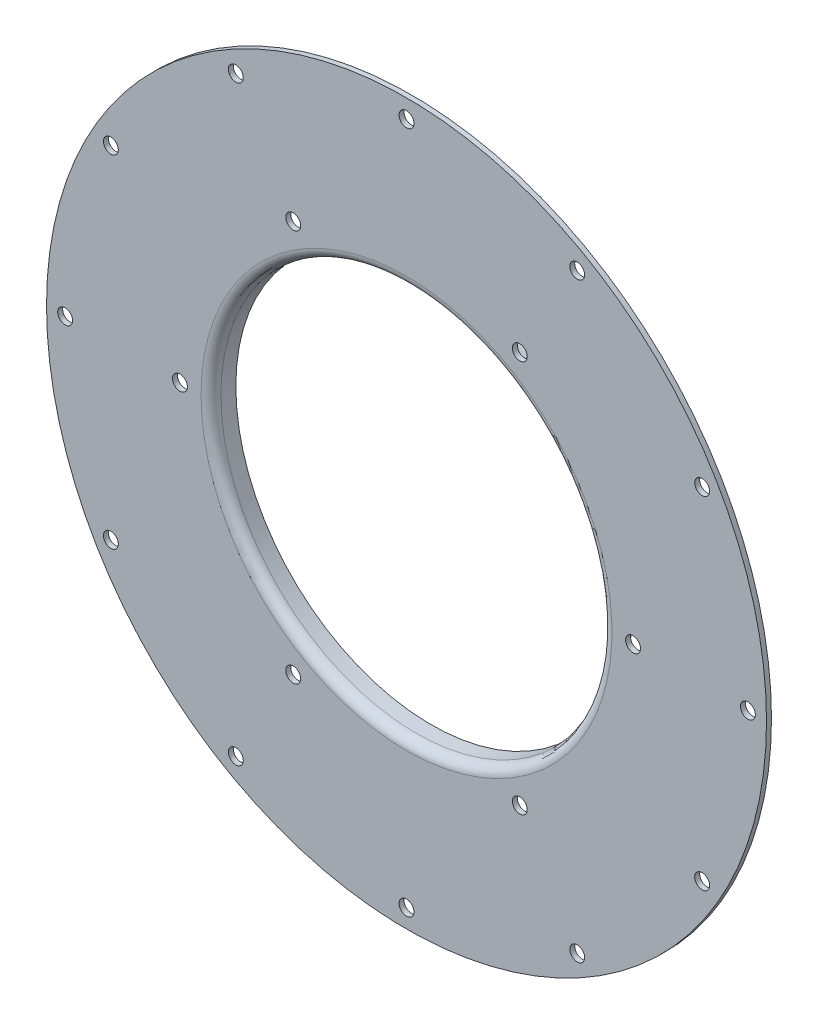
ISO-10303-21;
HEADER;
FILE_DESCRIPTION(('STEP AP214'),'2;1');
FILE_NAME('part.step','',(''),(''),'','','');
FILE_SCHEMA(('AUTOMOTIVE_DESIGN { 1 0 10303 214 1 1 1 1 }'));
ENDSEC;
DATA;
#1=APPLICATION_CONTEXT('core data for automotive mechanical design processes');
#2=APPLICATION_PROTOCOL_DEFINITION('international standard','automotive_design',2000,#1);
#3=PRODUCT_CONTEXT('',#1,'mechanical');
#4=PRODUCT('Part','Part','',(#3));
#5=PRODUCT_RELATED_PRODUCT_CATEGORY('part','',(#4));
#6=PRODUCT_DEFINITION_FORMATION('','',#4);
#7=PRODUCT_DEFINITION_CONTEXT('part definition',#1,'design');
#8=PRODUCT_DEFINITION('design','',#6,#7);
#9=PRODUCT_DEFINITION_SHAPE('','',#8);
#10=(LENGTH_UNIT() NAMED_UNIT(*) SI_UNIT(.MILLI.,.METRE.));
#11=(NAMED_UNIT(*) PLANE_ANGLE_UNIT() SI_UNIT($,.RADIAN.));
#12=(NAMED_UNIT(*) SI_UNIT($,.STERADIAN.) SOLID_ANGLE_UNIT());
#13=UNCERTAINTY_MEASURE_WITH_UNIT(LENGTH_MEASURE(1.E-05),#10,'distance_accuracy_value','');
#14=(GEOMETRIC_REPRESENTATION_CONTEXT(3) GLOBAL_UNCERTAINTY_ASSIGNED_CONTEXT((#13)) GLOBAL_UNIT_ASSIGNED_CONTEXT((#10,
#11,#12)) REPRESENTATION_CONTEXT('',''));
#15=CARTESIAN_POINT('',(0.,0.,0.));
#16=DIRECTION('',(0.,0.,1.));
#17=DIRECTION('',(1.,0.,0.));
#18=AXIS2_PLACEMENT_3D('',#15,#16,#17);
#19=CARTESIAN_POINT('',(0.,0.,0.));
#20=DIRECTION('',(0.,0.,-1.));
#21=DIRECTION('',(-1.,0.,0.));
#22=AXIS2_PLACEMENT_3D('',#19,#20,#21);
#23=CYLINDRICAL_SURFACE('',#22,161.5);
#24=CARTESIAN_POINT('',(0.,0.,-20.));
#25=DIRECTION('',(0.,0.,-1.));
#26=DIRECTION('',(-1.,0.,0.));
#27=AXIS2_PLACEMENT_3D('',#24,#25,#26);
#28=CIRCLE('',#27,161.5);
#29=CARTESIAN_POINT('',(-161.5,0.,-20.));
#30=VERTEX_POINT('',#29);
#31=EDGE_CURVE('E72',#30,#30,#28,.T.);
#32=ORIENTED_EDGE('',*,*,#31,.F.);
#33=EDGE_LOOP('',(#32));
#34=FACE_BOUND('',#33,.T.);
#35=CARTESIAN_POINT('',(0.,0.,-8.00000000000004));
#36=DIRECTION('',(0.,0.,-1.));
#37=DIRECTION('',(-1.,0.,0.));
#38=AXIS2_PLACEMENT_3D('',#35,#36,#37);
#39=CIRCLE('',#38,161.5);
#40=CARTESIAN_POINT('',(-161.5,0.,-8.00000000000004));
#41=VERTEX_POINT('',#40);
#42=EDGE_CURVE('E12',#41,#41,#39,.T.);
#43=ORIENTED_EDGE('',*,*,#42,.T.);
#44=EDGE_LOOP('',(#43));
#45=FACE_BOUND('',#44,.T.);
#46=ADVANCED_FACE('F44',(#34,#45),#23,.T.);
#47=CARTESIAN_POINT('',(0.,0.,-8.));
#48=DIRECTION('',(0.,0.,-1.));
#49=DIRECTION('',(-1.,0.,0.));
#50=AXIS2_PLACEMENT_3D('',#47,#48,#49);
#51=TOROIDAL_SURFACE('',#50,165.5,3.99999999999998);
#52=CARTESIAN_POINT('',(0.,0.,-4.00000000000001));
#53=DIRECTION('',(0.,0.,-1.));
#54=DIRECTION('',(-1.,0.,0.));
#55=AXIS2_PLACEMENT_3D('',#52,#53,#54);
#56=CIRCLE('',#55,165.5);
#57=CARTESIAN_POINT('',(-165.5,0.,-4.00000000000001));
#58=VERTEX_POINT('',#57);
#59=EDGE_CURVE('E50',#58,#58,#56,.T.);
#60=ORIENTED_EDGE('',*,*,#59,.T.);
#61=EDGE_LOOP('',(#60));
#62=FACE_BOUND('',#61,.T.);
#63=ORIENTED_EDGE('',*,*,#42,.F.);
#64=EDGE_LOOP('',(#63));
#65=FACE_BOUND('',#64,.T.);
#66=ADVANCED_FACE('F232',(#62,#65),#51,.F.);
#67=CARTESIAN_POINT('',(0.,0.,-4.00000000000001));
#68=DIRECTION('',(0.,0.,-1.));
#69=DIRECTION('',(-1.,0.,0.));
#70=AXIS2_PLACEMENT_3D('',#67,#68,#69);
#71=PLANE('',#70);
#72=CARTESIAN_POINT('',(137.499999999999,238.156986040721,-4.00000000000001));
#73=DIRECTION('',(0.,0.,-1.));
#74=DIRECTION('',(-1.,0.,0.));
#75=AXIS2_PLACEMENT_3D('',#72,#73,#74);
#76=CIRCLE('',#75,5.99999999999999);
#77=CARTESIAN_POINT('',(131.499999999999,238.156986040721,-4.00000000000001));
#78=VERTEX_POINT('',#77);
#79=EDGE_CURVE('E117',#78,#78,#76,.T.);
#80=ORIENTED_EDGE('',*,*,#79,.F.);
#81=EDGE_LOOP('',(#80));
#82=FACE_BOUND('',#81,.T.);
#83=CARTESIAN_POINT('',(-9.60157368181862E-13,275.,-4.00000000000001));
#84=DIRECTION('',(0.,0.,-1.));
#85=DIRECTION('',(-1.,0.,0.));
#86=AXIS2_PLACEMENT_3D('',#83,#84,#85);
#87=CIRCLE('',#86,5.99999999999999);
#88=CARTESIAN_POINT('',(-6.00000000000095,275.,-4.00000000000001));
#89=VERTEX_POINT('',#88);
#90=EDGE_CURVE('E120',#89,#89,#87,.T.);
#91=ORIENTED_EDGE('',*,*,#90,.F.);
#92=EDGE_LOOP('',(#91));
#93=FACE_BOUND('',#92,.T.);
#94=CARTESIAN_POINT('',(-137.500000000001,238.15698604072,-4.00000000000001));
#95=DIRECTION('',(0.,0.,-1.));
#96=DIRECTION('',(-1.,0.,0.));
#97=AXIS2_PLACEMENT_3D('',#94,#95,#96);
#98=CIRCLE('',#97,5.99999999999999);
#99=CARTESIAN_POINT('',(-143.500000000001,238.15698604072,-4.00000000000001));
#100=VERTEX_POINT('',#99);
#101=EDGE_CURVE('E123',#100,#100,#98,.T.);
#102=ORIENTED_EDGE('',*,*,#101,.F.);
#103=EDGE_LOOP('',(#102));
#104=FACE_BOUND('',#103,.T.);
#105=CARTESIAN_POINT('',(-238.156986040721,137.499999999999,-4.00000000000001));
#106=DIRECTION('',(0.,0.,-1.));
#107=DIRECTION('',(-1.,0.,0.));
#108=AXIS2_PLACEMENT_3D('',#105,#106,#107);
#109=CIRCLE('',#108,5.99999999999999);
#110=CARTESIAN_POINT('',(-244.156986040721,137.499999999999,-4.00000000000001));
#111=VERTEX_POINT('',#110);
#112=EDGE_CURVE('E126',#111,#111,#109,.T.);
#113=ORIENTED_EDGE('',*,*,#112,.F.);
#114=EDGE_LOOP('',(#113));
#115=FACE_BOUND('',#114,.T.);
#116=CARTESIAN_POINT('',(-275.,0.,-4.00000000000001));
#117=DIRECTION('',(0.,0.,-1.));
#118=DIRECTION('',(-1.,0.,0.));
#119=AXIS2_PLACEMENT_3D('',#116,#117,#118);
#120=CIRCLE('',#119,5.99999999999999);
#121=CARTESIAN_POINT('',(-281.,0.,-4.00000000000001));
#122=VERTEX_POINT('',#121);
#123=EDGE_CURVE('E129',#122,#122,#120,.T.);
#124=ORIENTED_EDGE('',*,*,#123,.F.);
#125=EDGE_LOOP('',(#124));
#126=FACE_BOUND('',#125,.T.);
#127=CARTESIAN_POINT('',(-238.15698604072,-137.500000000002,-4.00000000000001));
#128=DIRECTION('',(0.,0.,-1.));
#129=DIRECTION('',(-1.,0.,0.));
#130=AXIS2_PLACEMENT_3D('',#127,#128,#129);
#131=CIRCLE('',#130,5.99999999999999);
#132=CARTESIAN_POINT('',(-244.15698604072,-137.500000000002,-4.00000000000001));
#133=VERTEX_POINT('',#132);
#134=EDGE_CURVE('E132',#133,#133,#131,.T.);
#135=ORIENTED_EDGE('',*,*,#134,.F.);
#136=EDGE_LOOP('',(#135));
#137=FACE_BOUND('',#136,.T.);
#138=CARTESIAN_POINT('',(-137.499999999998,-238.156986040722,-4.00000000000001));
#139=DIRECTION('',(0.,0.,-1.));
#140=DIRECTION('',(-1.,0.,0.));
#141=AXIS2_PLACEMENT_3D('',#138,#139,#140);
#142=CIRCLE('',#141,5.99999999999999);
#143=CARTESIAN_POINT('',(-143.499999999998,-238.156986040722,-4.00000000000001));
#144=VERTEX_POINT('',#143);
#145=EDGE_CURVE('E135',#144,#144,#142,.T.);
#146=ORIENTED_EDGE('',*,*,#145,.F.);
#147=EDGE_LOOP('',(#146));
#148=FACE_BOUND('',#147,.T.);
#149=CARTESIAN_POINT('',(2.88047210454559E-12,-275.,-4.00000000000001));
#150=DIRECTION('',(0.,0.,-1.));
#151=DIRECTION('',(-1.,0.,0.));
#152=AXIS2_PLACEMENT_3D('',#149,#150,#151);
#153=CIRCLE('',#152,5.99999999999999);
#154=CARTESIAN_POINT('',(-5.99999999999711,-275.,-4.00000000000001));
#155=VERTEX_POINT('',#154);
#156=EDGE_CURVE('E138',#155,#155,#153,.T.);
#157=ORIENTED_EDGE('',*,*,#156,.F.);
#158=EDGE_LOOP('',(#157));
#159=FACE_BOUND('',#158,.T.);
#160=CARTESIAN_POINT('',(137.500000000003,-238.156986040719,-4.00000000000001));
#161=DIRECTION('',(0.,0.,-1.));
#162=DIRECTION('',(-1.,0.,0.));
#163=AXIS2_PLACEMENT_3D('',#160,#161,#162);
#164=CIRCLE('',#163,5.99999999999999);
#165=CARTESIAN_POINT('',(131.500000000003,-238.156986040719,-4.00000000000001));
#166=VERTEX_POINT('',#165);
#167=EDGE_CURVE('E141',#166,#166,#164,.T.);
#168=ORIENTED_EDGE('',*,*,#167,.F.);
#169=EDGE_LOOP('',(#168));
#170=FACE_BOUND('',#169,.T.);
#171=CARTESIAN_POINT('',(238.156986040722,-137.499999999997,-4.00000000000001));
#172=DIRECTION('',(0.,0.,-1.));
#173=DIRECTION('',(-1.,0.,0.));
#174=AXIS2_PLACEMENT_3D('',#171,#172,#173);
#175=CIRCLE('',#174,5.99999999999999);
#176=CARTESIAN_POINT('',(232.156986040722,-137.499999999997,-4.00000000000001));
#177=VERTEX_POINT('',#176);
#178=EDGE_CURVE('E144',#177,#177,#175,.T.);
#179=ORIENTED_EDGE('',*,*,#178,.F.);
#180=EDGE_LOOP('',(#179));
#181=FACE_BOUND('',#180,.T.);
#182=CARTESIAN_POINT('',(238.15698604072,137.5,-4.00000000000001));
#183=DIRECTION('',(0.,0.,-1.));
#184=DIRECTION('',(-1.,0.,0.));
#185=AXIS2_PLACEMENT_3D('',#182,#183,#184);
#186=CIRCLE('',#185,5.99999999999999);
#187=CARTESIAN_POINT('',(232.15698604072,137.5,-4.00000000000001));
#188=VERTEX_POINT('',#187);
#189=EDGE_CURVE('E147',#188,#188,#186,.T.);
#190=ORIENTED_EDGE('',*,*,#189,.F.);
#191=EDGE_LOOP('',(#190));
#192=FACE_BOUND('',#191,.T.);
#193=CARTESIAN_POINT('',(275.,0.,-4.00000000000001));
#194=DIRECTION('',(0.,0.,-1.));
#195=DIRECTION('',(-1.,0.,0.));
#196=AXIS2_PLACEMENT_3D('',#193,#194,#195);
#197=CIRCLE('',#196,5.99999999999999);
#198=CARTESIAN_POINT('',(269.,0.,-4.00000000000001));
#199=VERTEX_POINT('',#198);
#200=EDGE_CURVE('E104',#199,#199,#197,.T.);
#201=ORIENTED_EDGE('',*,*,#200,.F.);
#202=EDGE_LOOP('',(#201));
#203=FACE_BOUND('',#202,.T.);
#204=CARTESIAN_POINT('',(91.2500000000018,-158.049636190659,-4.00000000000001));
#205=DIRECTION('',(0.,0.,-1.));
#206=DIRECTION('',(-1.,0.,0.));
#207=AXIS2_PLACEMENT_3D('',#204,#205,#206);
#208=CIRCLE('',#207,6.00000000000002);
#209=CARTESIAN_POINT('',(85.2500000000018,-158.049636190659,-4.00000000000001));
#210=VERTEX_POINT('',#209);
#211=EDGE_CURVE('E81',#210,#210,#208,.T.);
#212=ORIENTED_EDGE('',*,*,#211,.F.);
#213=EDGE_LOOP('',(#212));
#214=FACE_BOUND('',#213,.T.);
#215=CARTESIAN_POINT('',(-91.2499999999985,-158.049636190661,-4.00000000000001));
#216=DIRECTION('',(0.,0.,-1.));
#217=DIRECTION('',(-1.,0.,0.));
#218=AXIS2_PLACEMENT_3D('',#215,#216,#217);
#219=CIRCLE('',#218,6.00000000000002);
#220=CARTESIAN_POINT('',(-97.2499999999986,-158.049636190661,-4.00000000000001));
#221=VERTEX_POINT('',#220);
#222=EDGE_CURVE('E84',#221,#221,#219,.T.);
#223=ORIENTED_EDGE('',*,*,#222,.F.);
#224=EDGE_LOOP('',(#223));
#225=FACE_BOUND('',#224,.T.);
#226=CARTESIAN_POINT('',(-182.5,0.,-4.00000000000001));
#227=DIRECTION('',(0.,0.,-1.));
#228=DIRECTION('',(-1.,0.,0.));
#229=AXIS2_PLACEMENT_3D('',#226,#227,#228);
#230=CIRCLE('',#229,6.00000000000002);
#231=CARTESIAN_POINT('',(-188.5,0.,-4.00000000000001));
#232=VERTEX_POINT('',#231);
#233=EDGE_CURVE('E87',#232,#232,#230,.T.);
#234=ORIENTED_EDGE('',*,*,#233,.F.);
#235=EDGE_LOOP('',(#234));
#236=FACE_BOUND('',#235,.T.);
#237=CARTESIAN_POINT('',(-91.2500000000008,158.04963619066,-4.00000000000001));
#238=DIRECTION('',(0.,0.,-1.));
#239=DIRECTION('',(-1.,0.,0.));
#240=AXIS2_PLACEMENT_3D('',#237,#238,#239);
#241=CIRCLE('',#240,6.00000000000002);
#242=CARTESIAN_POINT('',(-97.2500000000008,158.04963619066,-4.00000000000001));
#243=VERTEX_POINT('',#242);
#244=EDGE_CURVE('E90',#243,#243,#241,.T.);
#245=ORIENTED_EDGE('',*,*,#244,.F.);
#246=EDGE_LOOP('',(#245));
#247=FACE_BOUND('',#246,.T.);
#248=CARTESIAN_POINT('',(91.2499999999996,158.04963619066,-4.00000000000001));
#249=DIRECTION('',(0.,0.,-1.));
#250=DIRECTION('',(-1.,0.,0.));
#251=AXIS2_PLACEMENT_3D('',#248,#249,#250);
#252=CIRCLE('',#251,6.00000000000002);
#253=CARTESIAN_POINT('',(85.2499999999996,158.04963619066,-4.00000000000001));
#254=VERTEX_POINT('',#253);
#255=EDGE_CURVE('E93',#254,#254,#252,.T.);
#256=ORIENTED_EDGE('',*,*,#255,.F.);
#257=EDGE_LOOP('',(#256));
#258=FACE_BOUND('',#257,.T.);
#259=CARTESIAN_POINT('',(182.5,0.,-4.00000000000001));
#260=DIRECTION('',(0.,0.,-1.));
#261=DIRECTION('',(-1.,0.,0.));
#262=AXIS2_PLACEMENT_3D('',#259,#260,#261);
#263=CIRCLE('',#262,6.00000000000002);
#264=CARTESIAN_POINT('',(176.5,0.,-4.00000000000001));
#265=VERTEX_POINT('',#264);
#266=EDGE_CURVE('E75',#265,#265,#263,.T.);
#267=ORIENTED_EDGE('',*,*,#266,.F.);
#268=EDGE_LOOP('',(#267));
#269=FACE_BOUND('',#268,.T.);
#270=CARTESIAN_POINT('',(0.,0.,-4.));
#271=DIRECTION('',(0.,0.,-1.));
#272=DIRECTION('',(-1.,0.,0.));
#273=AXIS2_PLACEMENT_3D('',#270,#271,#272);
#274=CIRCLE('',#273,290.);
#275=CARTESIAN_POINT('',(-290.,0.,-4.));
#276=VERTEX_POINT('',#275);
#277=EDGE_CURVE('E54',#276,#276,#274,.T.);
#278=ORIENTED_EDGE('',*,*,#277,.T.);
#279=EDGE_LOOP('',(#278));
#280=FACE_BOUND('',#279,.T.);
#281=ORIENTED_EDGE('',*,*,#59,.F.);
#282=EDGE_LOOP('',(#281));
#283=FACE_BOUND('',#282,.T.);
#284=ADVANCED_FACE('F237',(#82,#93,#104,#115,#126,#137,#148,#159,#170,#181,#192,#203,#214,#225,
#236,#247,#258,#269,#280,#283),#71,.T.);
#285=CARTESIAN_POINT('',(0.,0.,0.));
#286=DIRECTION('',(0.,0.,-1.));
#287=DIRECTION('',(-1.,0.,0.));
#288=AXIS2_PLACEMENT_3D('',#285,#286,#287);
#289=CYLINDRICAL_SURFACE('',#288,290.);
#290=CARTESIAN_POINT('',(0.,0.,0.));
#291=DIRECTION('',(0.,0.,-1.));
#292=DIRECTION('',(-1.,0.,0.));
#293=AXIS2_PLACEMENT_3D('',#290,#291,#292);
#294=CIRCLE('',#293,290.);
#295=CARTESIAN_POINT('',(-290.,0.,0.));
#296=VERTEX_POINT('',#295);
#297=EDGE_CURVE('E58',#296,#296,#294,.T.);
#298=ORIENTED_EDGE('',*,*,#297,.T.);
#299=EDGE_LOOP('',(#298));
#300=FACE_BOUND('',#299,.T.);
#301=ORIENTED_EDGE('',*,*,#277,.F.);
#302=EDGE_LOOP('',(#301));
#303=FACE_BOUND('',#302,.T.);
#304=ADVANCED_FACE('F190',(#300,#303),#289,.T.);
#305=CARTESIAN_POINT('',(0.,0.,0.));
#306=DIRECTION('',(0.,0.,-1.));
#307=DIRECTION('',(-1.,0.,0.));
#308=AXIS2_PLACEMENT_3D('',#305,#306,#307);
#309=PLANE('',#308);
#310=CARTESIAN_POINT('',(137.499999999999,238.156986040721,0.));
#311=DIRECTION('',(0.,0.,1.));
#312=DIRECTION('',(0.499999999999998,0.86602540378444,0.));
#313=AXIS2_PLACEMENT_3D('',#310,#311,#312);
#314=CIRCLE('',#313,5.99999999999999);
#315=CARTESIAN_POINT('',(140.499999999999,243.353138463428,0.));
#316=VERTEX_POINT('',#315);
#317=EDGE_CURVE('E153',#316,#316,#314,.T.);
#318=ORIENTED_EDGE('',*,*,#317,.F.);
#319=EDGE_LOOP('',(#318));
#320=FACE_BOUND('',#319,.T.);
#321=CARTESIAN_POINT('',(-9.60157368181862E-13,275.,0.));
#322=DIRECTION('',(0.,0.,1.));
#323=DIRECTION('',(0.,1.,0.));
#324=AXIS2_PLACEMENT_3D('',#321,#322,#323);
#325=CIRCLE('',#324,5.99999999999999);
#326=CARTESIAN_POINT('',(-9.8110625621492E-13,281.,0.));
#327=VERTEX_POINT('',#326);
#328=EDGE_CURVE('E173',#327,#327,#325,.T.);
#329=ORIENTED_EDGE('',*,*,#328,.F.);
#330=EDGE_LOOP('',(#329));
#331=FACE_BOUND('',#330,.T.);
#332=CARTESIAN_POINT('',(-137.500000000001,238.15698604072,0.));
#333=DIRECTION('',(0.,0.,1.));
#334=DIRECTION('',(-0.500000000000004,0.866025403784436,0.));
#335=AXIS2_PLACEMENT_3D('',#332,#333,#334);
#336=CIRCLE('',#335,5.99999999999999);
#337=CARTESIAN_POINT('',(-140.500000000001,243.353138463427,0.));
#338=VERTEX_POINT('',#337);
#339=EDGE_CURVE('E170',#338,#338,#336,.T.);
#340=ORIENTED_EDGE('',*,*,#339,.F.);
#341=EDGE_LOOP('',(#340));
#342=FACE_BOUND('',#341,.T.);
#343=CARTESIAN_POINT('',(-238.156986040721,137.499999999999,0.));
#344=DIRECTION('',(0.,0.,1.));
#345=DIRECTION('',(-0.866025403784442,0.499999999999995,0.));
#346=AXIS2_PLACEMENT_3D('',#343,#344,#345);
#347=CIRCLE('',#346,5.99999999999999);
#348=CARTESIAN_POINT('',(-243.353138463428,140.499999999999,0.));
#349=VERTEX_POINT('',#348);
#350=EDGE_CURVE('E167',#349,#349,#347,.T.);
#351=ORIENTED_EDGE('',*,*,#350,.F.);
#352=EDGE_LOOP('',(#351));
#353=FACE_BOUND('',#352,.T.);
#354=CARTESIAN_POINT('',(-275.,0.,0.));
#355=DIRECTION('',(0.,0.,1.));
#356=DIRECTION('',(-1.,0.,0.));
#357=AXIS2_PLACEMENT_3D('',#354,#355,#356);
#358=CIRCLE('',#357,5.99999999999999);
#359=CARTESIAN_POINT('',(-281.,0.,0.));
#360=VERTEX_POINT('',#359);
#361=EDGE_CURVE('E164',#360,#360,#358,.T.);
#362=ORIENTED_EDGE('',*,*,#361,.F.);
#363=EDGE_LOOP('',(#362));
#364=FACE_BOUND('',#363,.T.);
#365=CARTESIAN_POINT('',(-238.15698604072,-137.500000000002,0.));
#366=DIRECTION('',(0.,0.,1.));
#367=DIRECTION('',(-0.866025403784435,-0.500000000000007,0.));
#368=AXIS2_PLACEMENT_3D('',#365,#366,#367);
#369=CIRCLE('',#368,5.99999999999999);
#370=CARTESIAN_POINT('',(-243.353138463426,-140.500000000002,0.));
#371=VERTEX_POINT('',#370);
#372=EDGE_CURVE('E161',#371,#371,#369,.T.);
#373=ORIENTED_EDGE('',*,*,#372,.F.);
#374=EDGE_LOOP('',(#373));
#375=FACE_BOUND('',#374,.T.);
#376=CARTESIAN_POINT('',(-137.499999999998,-238.156986040722,0.));
#377=DIRECTION('',(0.,0.,1.));
#378=DIRECTION('',(-0.499999999999992,-0.866025403784443,0.));
#379=AXIS2_PLACEMENT_3D('',#376,#377,#378);
#380=CIRCLE('',#379,5.99999999999999);
#381=CARTESIAN_POINT('',(-140.499999999998,-243.353138463429,0.));
#382=VERTEX_POINT('',#381);
#383=EDGE_CURVE('E157',#382,#382,#380,.T.);
#384=ORIENTED_EDGE('',*,*,#383,.F.);
#385=EDGE_LOOP('',(#384));
#386=FACE_BOUND('',#385,.T.);
#387=CARTESIAN_POINT('',(2.88047210454559E-12,-275.,0.));
#388=DIRECTION('',(0.,0.,1.));
#389=DIRECTION('',(0.,-1.,0.));
#390=AXIS2_PLACEMENT_3D('',#387,#388,#389);
#391=CIRCLE('',#390,5.99999999999999);
#392=CARTESIAN_POINT('',(2.94331876864476E-12,-281.,0.));
#393=VERTEX_POINT('',#392);
#394=EDGE_CURVE('E154',#393,#393,#391,.T.);
#395=ORIENTED_EDGE('',*,*,#394,.F.);
#396=EDGE_LOOP('',(#395));
#397=FACE_BOUND('',#396,.T.);
#398=CARTESIAN_POINT('',(137.500000000003,-238.156986040719,0.));
#399=DIRECTION('',(0.,0.,1.));
#400=DIRECTION('',(0.50000000000001,-0.866025403784433,0.));
#401=AXIS2_PLACEMENT_3D('',#398,#399,#400);
#402=CIRCLE('',#401,5.99999999999999);
#403=CARTESIAN_POINT('',(140.500000000003,-243.353138463426,0.));
#404=VERTEX_POINT('',#403);
#405=EDGE_CURVE('E158',#404,#404,#402,.T.);
#406=ORIENTED_EDGE('',*,*,#405,.F.);
#407=EDGE_LOOP('',(#406));
#408=FACE_BOUND('',#407,.T.);
#409=CARTESIAN_POINT('',(238.156986040722,-137.499999999997,0.));
#410=DIRECTION('',(0.,0.,1.));
#411=DIRECTION('',(0.866025403784445,-0.499999999999989,0.));
#412=AXIS2_PLACEMENT_3D('',#409,#410,#411);
#413=CIRCLE('',#412,5.99999999999999);
#414=CARTESIAN_POINT('',(243.353138463429,-140.499999999997,0.));
#415=VERTEX_POINT('',#414);
#416=EDGE_CURVE('E178',#415,#415,#413,.T.);
#417=ORIENTED_EDGE('',*,*,#416,.F.);
#418=EDGE_LOOP('',(#417));
#419=FACE_BOUND('',#418,.T.);
#420=CARTESIAN_POINT('',(238.15698604072,137.5,0.));
#421=DIRECTION('',(0.,0.,1.));
#422=DIRECTION('',(0.866025403784438,0.500000000000001,0.));
#423=AXIS2_PLACEMENT_3D('',#420,#421,#422);
#424=CIRCLE('',#423,5.99999999999999);
#425=CARTESIAN_POINT('',(243.353138463427,140.5,0.));
#426=VERTEX_POINT('',#425);
#427=EDGE_CURVE('E150',#426,#426,#424,.T.);
#428=ORIENTED_EDGE('',*,*,#427,.F.);
#429=EDGE_LOOP('',(#428));
#430=FACE_BOUND('',#429,.T.);
#431=CARTESIAN_POINT('',(275.,0.,0.));
#432=DIRECTION('',(0.,0.,1.));
#433=DIRECTION('',(1.,0.,0.));
#434=AXIS2_PLACEMENT_3D('',#431,#432,#433);
#435=CIRCLE('',#434,5.99999999999999);
#436=CARTESIAN_POINT('',(281.,0.,0.));
#437=VERTEX_POINT('',#436);
#438=EDGE_CURVE('E114',#437,#437,#435,.T.);
#439=ORIENTED_EDGE('',*,*,#438,.F.);
#440=EDGE_LOOP('',(#439));
#441=FACE_BOUND('',#440,.T.);
#442=CARTESIAN_POINT('',(91.2500000000018,-158.049636190659,0.));
#443=DIRECTION('',(0.,0.,1.));
#444=DIRECTION('',(0.50000000000001,-0.866025403784433,0.));
#445=AXIS2_PLACEMENT_3D('',#442,#443,#444);
#446=CIRCLE('',#445,6.00000000000002);
#447=CARTESIAN_POINT('',(94.2500000000019,-163.245788613366,0.));
#448=VERTEX_POINT('',#447);
#449=EDGE_CURVE('E100',#448,#448,#446,.T.);
#450=ORIENTED_EDGE('',*,*,#449,.F.);
#451=EDGE_LOOP('',(#450));
#452=FACE_BOUND('',#451,.T.);
#453=CARTESIAN_POINT('',(-91.2499999999985,-158.049636190661,0.));
#454=DIRECTION('',(0.,0.,1.));
#455=DIRECTION('',(-0.499999999999992,-0.866025403784443,0.));
#456=AXIS2_PLACEMENT_3D('',#453,#454,#455);
#457=CIRCLE('',#456,6.00000000000002);
#458=CARTESIAN_POINT('',(-94.2499999999985,-163.245788613368,0.));
#459=VERTEX_POINT('',#458);
#460=EDGE_CURVE('E103',#459,#459,#457,.T.);
#461=ORIENTED_EDGE('',*,*,#460,.F.);
#462=EDGE_LOOP('',(#461));
#463=FACE_BOUND('',#462,.T.);
#464=CARTESIAN_POINT('',(-182.5,0.,0.));
#465=DIRECTION('',(0.,0.,1.));
#466=DIRECTION('',(-1.,0.,0.));
#467=AXIS2_PLACEMENT_3D('',#464,#465,#466);
#468=CIRCLE('',#467,6.00000000000002);
#469=CARTESIAN_POINT('',(-188.5,0.,0.));
#470=VERTEX_POINT('',#469);
#471=EDGE_CURVE('E107',#470,#470,#468,.T.);
#472=ORIENTED_EDGE('',*,*,#471,.F.);
#473=EDGE_LOOP('',(#472));
#474=FACE_BOUND('',#473,.T.);
#475=CARTESIAN_POINT('',(-91.2500000000008,158.04963619066,0.));
#476=DIRECTION('',(0.,0.,1.));
#477=DIRECTION('',(-0.500000000000004,0.866025403784436,0.));
#478=AXIS2_PLACEMENT_3D('',#475,#476,#477);
#479=CIRCLE('',#478,6.00000000000002);
#480=CARTESIAN_POINT('',(-94.2500000000008,163.245788613366,0.));
#481=VERTEX_POINT('',#480);
#482=EDGE_CURVE('E99',#481,#481,#479,.T.);
#483=ORIENTED_EDGE('',*,*,#482,.F.);
#484=EDGE_LOOP('',(#483));
#485=FACE_BOUND('',#484,.T.);
#486=CARTESIAN_POINT('',(91.2499999999996,158.04963619066,0.));
#487=DIRECTION('',(0.,0.,1.));
#488=DIRECTION('',(0.499999999999998,0.86602540378444,0.));
#489=AXIS2_PLACEMENT_3D('',#486,#487,#488);
#490=CIRCLE('',#489,6.00000000000002);
#491=CARTESIAN_POINT('',(94.2499999999996,163.245788613367,0.));
#492=VERTEX_POINT('',#491);
#493=EDGE_CURVE('E96',#492,#492,#490,.T.);
#494=ORIENTED_EDGE('',*,*,#493,.F.);
#495=EDGE_LOOP('',(#494));
#496=FACE_BOUND('',#495,.T.);
#497=CARTESIAN_POINT('',(182.5,0.,0.));
#498=DIRECTION('',(0.,0.,1.));
#499=DIRECTION('',(1.,0.,0.));
#500=AXIS2_PLACEMENT_3D('',#497,#498,#499);
#501=CIRCLE('',#500,6.00000000000002);
#502=CARTESIAN_POINT('',(188.5,0.,0.));
#503=VERTEX_POINT('',#502);
#504=EDGE_CURVE('E78',#503,#503,#501,.T.);
#505=ORIENTED_EDGE('',*,*,#504,.F.);
#506=EDGE_LOOP('',(#505));
#507=FACE_BOUND('',#506,.T.);
#508=ORIENTED_EDGE('',*,*,#297,.F.);
#509=EDGE_LOOP('',(#508));
#510=FACE_BOUND('',#509,.T.);
#511=CARTESIAN_POINT('',(0.,0.,0.));
#512=DIRECTION('',(0.,0.,-1.));
#513=DIRECTION('',(-1.,0.,0.));
#514=AXIS2_PLACEMENT_3D('',#511,#512,#513);
#515=CIRCLE('',#514,165.5);
#516=CARTESIAN_POINT('',(-165.5,0.,0.));
#517=VERTEX_POINT('',#516);
#518=EDGE_CURVE('E63',#517,#517,#515,.T.);
#519=ORIENTED_EDGE('',*,*,#518,.T.);
#520=EDGE_LOOP('',(#519));
#521=FACE_BOUND('',#520,.T.);
#522=ADVANCED_FACE('F186',(#320,#331,#342,#353,#364,#375,#386,#397,#408,#419,#430,#441,#452,
#463,#474,#485,#496,#507,#510,#521),#309,.F.);
#523=CARTESIAN_POINT('',(0.,0.,-8.));
#524=DIRECTION('',(0.,0.,-1.));
#525=DIRECTION('',(-1.,0.,0.));
#526=AXIS2_PLACEMENT_3D('',#523,#524,#525);
#527=TOROIDAL_SURFACE('',#526,165.5,7.99999999999999);
#528=ORIENTED_EDGE('',*,*,#518,.F.);
#529=EDGE_LOOP('',(#528));
#530=FACE_BOUND('',#529,.T.);
#531=CARTESIAN_POINT('',(0.,0.,-8.00000000000004));
#532=DIRECTION('',(0.,0.,-1.));
#533=DIRECTION('',(-1.,0.,0.));
#534=AXIS2_PLACEMENT_3D('',#531,#532,#533);
#535=CIRCLE('',#534,157.5);
#536=CARTESIAN_POINT('',(-157.5,0.,-8.00000000000004));
#537=VERTEX_POINT('',#536);
#538=EDGE_CURVE('E66',#537,#537,#535,.T.);
#539=ORIENTED_EDGE('',*,*,#538,.T.);
#540=EDGE_LOOP('',(#539));
#541=FACE_BOUND('',#540,.T.);
#542=ADVANCED_FACE('F189',(#530,#541),#527,.T.);
#543=CARTESIAN_POINT('',(0.,0.,0.));
#544=DIRECTION('',(0.,0.,-1.));
#545=DIRECTION('',(-1.,0.,0.));
#546=AXIS2_PLACEMENT_3D('',#543,#544,#545);
#547=CYLINDRICAL_SURFACE('',#546,157.5);
#548=CARTESIAN_POINT('',(0.,0.,-20.));
#549=DIRECTION('',(0.,0.,-1.));
#550=DIRECTION('',(-1.,0.,0.));
#551=AXIS2_PLACEMENT_3D('',#548,#549,#550);
#552=CIRCLE('',#551,157.5);
#553=CARTESIAN_POINT('',(-157.5,0.,-20.));
#554=VERTEX_POINT('',#553);
#555=EDGE_CURVE('E69',#554,#554,#552,.T.);
#556=ORIENTED_EDGE('',*,*,#555,.T.);
#557=EDGE_LOOP('',(#556));
#558=FACE_BOUND('',#557,.T.);
#559=ORIENTED_EDGE('',*,*,#538,.F.);
#560=EDGE_LOOP('',(#559));
#561=FACE_BOUND('',#560,.T.);
#562=ADVANCED_FACE('F217',(#558,#561),#547,.F.);
#563=CARTESIAN_POINT('',(0.,0.,-20.));
#564=DIRECTION('',(0.,0.,-1.));
#565=DIRECTION('',(-1.,0.,0.));
#566=AXIS2_PLACEMENT_3D('',#563,#564,#565);
#567=PLANE('',#566);
#568=ORIENTED_EDGE('',*,*,#31,.T.);
#569=EDGE_LOOP('',(#568));
#570=FACE_BOUND('',#569,.T.);
#571=ORIENTED_EDGE('',*,*,#555,.F.);
#572=EDGE_LOOP('',(#571));
#573=FACE_BOUND('',#572,.T.);
#574=ADVANCED_FACE('F222',(#570,#573),#567,.T.);
#575=CARTESIAN_POINT('',(182.5,0.,-10.));
#576=DIRECTION('',(0.,0.,1.));
#577=DIRECTION('',(1.,0.,0.));
#578=AXIS2_PLACEMENT_3D('',#575,#576,#577);
#579=CYLINDRICAL_SURFACE('',#578,6.00000000000002);
#580=ORIENTED_EDGE('',*,*,#266,.T.);
#581=EDGE_LOOP('',(#580));
#582=FACE_BOUND('',#581,.T.);
#583=ORIENTED_EDGE('',*,*,#504,.T.);
#584=EDGE_LOOP('',(#583));
#585=FACE_BOUND('',#584,.T.);
#586=ADVANCED_FACE('F228',(#582,#585),#579,.F.);
#587=CARTESIAN_POINT('',(91.2499999999996,158.04963619066,-10.));
#588=DIRECTION('',(0.,0.,1.));
#589=DIRECTION('',(1.,0.,0.));
#590=AXIS2_PLACEMENT_3D('',#587,#588,#589);
#591=CYLINDRICAL_SURFACE('',#590,6.00000000000002);
#592=ORIENTED_EDGE('',*,*,#255,.T.);
#593=EDGE_LOOP('',(#592));
#594=FACE_BOUND('',#593,.T.);
#595=ORIENTED_EDGE('',*,*,#493,.T.);
#596=EDGE_LOOP('',(#595));
#597=FACE_BOUND('',#596,.T.);
#598=ADVANCED_FACE('F286',(#594,#597),#591,.F.);
#599=CARTESIAN_POINT('',(-91.2500000000008,158.04963619066,-10.));
#600=DIRECTION('',(0.,0.,1.));
#601=DIRECTION('',(1.,0.,0.));
#602=AXIS2_PLACEMENT_3D('',#599,#600,#601);
#603=CYLINDRICAL_SURFACE('',#602,6.00000000000002);
#604=ORIENTED_EDGE('',*,*,#244,.T.);
#605=EDGE_LOOP('',(#604));
#606=FACE_BOUND('',#605,.T.);
#607=ORIENTED_EDGE('',*,*,#482,.T.);
#608=EDGE_LOOP('',(#607));
#609=FACE_BOUND('',#608,.T.);
#610=ADVANCED_FACE('F296',(#606,#609),#603,.F.);
#611=CARTESIAN_POINT('',(-182.5,0.,-10.));
#612=DIRECTION('',(0.,0.,1.));
#613=DIRECTION('',(1.,0.,0.));
#614=AXIS2_PLACEMENT_3D('',#611,#612,#613);
#615=CYLINDRICAL_SURFACE('',#614,6.00000000000002);
#616=ORIENTED_EDGE('',*,*,#233,.T.);
#617=EDGE_LOOP('',(#616));
#618=FACE_BOUND('',#617,.T.);
#619=ORIENTED_EDGE('',*,*,#471,.T.);
#620=EDGE_LOOP('',(#619));
#621=FACE_BOUND('',#620,.T.);
#622=ADVANCED_FACE('F306',(#618,#621),#615,.F.);
#623=CARTESIAN_POINT('',(-91.2499999999985,-158.049636190661,-10.));
#624=DIRECTION('',(0.,0.,1.));
#625=DIRECTION('',(1.,0.,0.));
#626=AXIS2_PLACEMENT_3D('',#623,#624,#625);
#627=CYLINDRICAL_SURFACE('',#626,6.00000000000002);
#628=ORIENTED_EDGE('',*,*,#222,.T.);
#629=EDGE_LOOP('',(#628));
#630=FACE_BOUND('',#629,.T.);
#631=ORIENTED_EDGE('',*,*,#460,.T.);
#632=EDGE_LOOP('',(#631));
#633=FACE_BOUND('',#632,.T.);
#634=ADVANCED_FACE('F316',(#630,#633),#627,.F.);
#635=CARTESIAN_POINT('',(91.2500000000018,-158.049636190659,-10.));
#636=DIRECTION('',(0.,0.,1.));
#637=DIRECTION('',(1.,0.,0.));
#638=AXIS2_PLACEMENT_3D('',#635,#636,#637);
#639=CYLINDRICAL_SURFACE('',#638,6.00000000000002);
#640=ORIENTED_EDGE('',*,*,#211,.T.);
#641=EDGE_LOOP('',(#640));
#642=FACE_BOUND('',#641,.T.);
#643=ORIENTED_EDGE('',*,*,#449,.T.);
#644=EDGE_LOOP('',(#643));
#645=FACE_BOUND('',#644,.T.);
#646=ADVANCED_FACE('F326',(#642,#645),#639,.F.);
#647=CARTESIAN_POINT('',(275.,0.,-10.));
#648=DIRECTION('',(0.,0.,1.));
#649=DIRECTION('',(1.,0.,0.));
#650=AXIS2_PLACEMENT_3D('',#647,#648,#649);
#651=CYLINDRICAL_SURFACE('',#650,5.99999999999999);
#652=ORIENTED_EDGE('',*,*,#200,.T.);
#653=EDGE_LOOP('',(#652));
#654=FACE_BOUND('',#653,.T.);
#655=ORIENTED_EDGE('',*,*,#438,.T.);
#656=EDGE_LOOP('',(#655));
#657=FACE_BOUND('',#656,.T.);
#658=ADVANCED_FACE('F336',(#654,#657),#651,.F.);
#659=CARTESIAN_POINT('',(238.15698604072,137.5,-10.));
#660=DIRECTION('',(0.,0.,1.));
#661=DIRECTION('',(1.,0.,0.));
#662=AXIS2_PLACEMENT_3D('',#659,#660,#661);
#663=CYLINDRICAL_SURFACE('',#662,5.99999999999999);
#664=ORIENTED_EDGE('',*,*,#189,.T.);
#665=EDGE_LOOP('',(#664));
#666=FACE_BOUND('',#665,.T.);
#667=ORIENTED_EDGE('',*,*,#427,.T.);
#668=EDGE_LOOP('',(#667));
#669=FACE_BOUND('',#668,.T.);
#670=ADVANCED_FACE('F345',(#666,#669),#663,.F.);
#671=CARTESIAN_POINT('',(238.156986040722,-137.499999999997,-10.));
#672=DIRECTION('',(0.,0.,1.));
#673=DIRECTION('',(1.,0.,0.));
#674=AXIS2_PLACEMENT_3D('',#671,#672,#673);
#675=CYLINDRICAL_SURFACE('',#674,5.99999999999999);
#676=ORIENTED_EDGE('',*,*,#178,.T.);
#677=EDGE_LOOP('',(#676));
#678=FACE_BOUND('',#677,.T.);
#679=ORIENTED_EDGE('',*,*,#416,.T.);
#680=EDGE_LOOP('',(#679));
#681=FACE_BOUND('',#680,.T.);
#682=ADVANCED_FACE('F371',(#678,#681),#675,.F.);
#683=CARTESIAN_POINT('',(137.500000000003,-238.156986040719,-10.));
#684=DIRECTION('',(0.,0.,1.));
#685=DIRECTION('',(1.,0.,0.));
#686=AXIS2_PLACEMENT_3D('',#683,#684,#685);
#687=CYLINDRICAL_SURFACE('',#686,5.99999999999999);
#688=ORIENTED_EDGE('',*,*,#167,.T.);
#689=EDGE_LOOP('',(#688));
#690=FACE_BOUND('',#689,.T.);
#691=ORIENTED_EDGE('',*,*,#405,.T.);
#692=EDGE_LOOP('',(#691));
#693=FACE_BOUND('',#692,.T.);
#694=ADVANCED_FACE('F184',(#690,#693),#687,.F.);
#695=CARTESIAN_POINT('',(2.88047210454559E-12,-275.,-10.));
#696=DIRECTION('',(0.,0.,1.));
#697=DIRECTION('',(1.,0.,0.));
#698=AXIS2_PLACEMENT_3D('',#695,#696,#697);
#699=CYLINDRICAL_SURFACE('',#698,5.99999999999999);
#700=ORIENTED_EDGE('',*,*,#156,.T.);
#701=EDGE_LOOP('',(#700));
#702=FACE_BOUND('',#701,.T.);
#703=ORIENTED_EDGE('',*,*,#394,.T.);
#704=EDGE_LOOP('',(#703));
#705=FACE_BOUND('',#704,.T.);
#706=ADVANCED_FACE('F385',(#702,#705),#699,.F.);
#707=CARTESIAN_POINT('',(-137.499999999998,-238.156986040722,-10.));
#708=DIRECTION('',(0.,0.,1.));
#709=DIRECTION('',(1.,0.,0.));
#710=AXIS2_PLACEMENT_3D('',#707,#708,#709);
#711=CYLINDRICAL_SURFACE('',#710,5.99999999999999);
#712=ORIENTED_EDGE('',*,*,#145,.T.);
#713=EDGE_LOOP('',(#712));
#714=FACE_BOUND('',#713,.T.);
#715=ORIENTED_EDGE('',*,*,#383,.T.);
#716=EDGE_LOOP('',(#715));
#717=FACE_BOUND('',#716,.T.);
#718=ADVANCED_FACE('F393',(#714,#717),#711,.F.);
#719=CARTESIAN_POINT('',(-238.15698604072,-137.500000000002,-10.));
#720=DIRECTION('',(0.,0.,1.));
#721=DIRECTION('',(1.,0.,0.));
#722=AXIS2_PLACEMENT_3D('',#719,#720,#721);
#723=CYLINDRICAL_SURFACE('',#722,5.99999999999999);
#724=ORIENTED_EDGE('',*,*,#134,.T.);
#725=EDGE_LOOP('',(#724));
#726=FACE_BOUND('',#725,.T.);
#727=ORIENTED_EDGE('',*,*,#372,.T.);
#728=EDGE_LOOP('',(#727));
#729=FACE_BOUND('',#728,.T.);
#730=ADVANCED_FACE('F401',(#726,#729),#723,.F.);
#731=CARTESIAN_POINT('',(-275.,0.,-10.));
#732=DIRECTION('',(0.,0.,1.));
#733=DIRECTION('',(1.,0.,0.));
#734=AXIS2_PLACEMENT_3D('',#731,#732,#733);
#735=CYLINDRICAL_SURFACE('',#734,5.99999999999999);
#736=ORIENTED_EDGE('',*,*,#123,.T.);
#737=EDGE_LOOP('',(#736));
#738=FACE_BOUND('',#737,.T.);
#739=ORIENTED_EDGE('',*,*,#361,.T.);
#740=EDGE_LOOP('',(#739));
#741=FACE_BOUND('',#740,.T.);
#742=ADVANCED_FACE('F409',(#738,#741),#735,.F.);
#743=CARTESIAN_POINT('',(-238.156986040721,137.499999999999,-10.));
#744=DIRECTION('',(0.,0.,1.));
#745=DIRECTION('',(1.,0.,0.));
#746=AXIS2_PLACEMENT_3D('',#743,#744,#745);
#747=CYLINDRICAL_SURFACE('',#746,5.99999999999999);
#748=ORIENTED_EDGE('',*,*,#112,.T.);
#749=EDGE_LOOP('',(#748));
#750=FACE_BOUND('',#749,.T.);
#751=ORIENTED_EDGE('',*,*,#350,.T.);
#752=EDGE_LOOP('',(#751));
#753=FACE_BOUND('',#752,.T.);
#754=ADVANCED_FACE('F417',(#750,#753),#747,.F.);
#755=CARTESIAN_POINT('',(-137.500000000001,238.15698604072,-10.));
#756=DIRECTION('',(0.,0.,1.));
#757=DIRECTION('',(1.,0.,0.));
#758=AXIS2_PLACEMENT_3D('',#755,#756,#757);
#759=CYLINDRICAL_SURFACE('',#758,5.99999999999999);
#760=ORIENTED_EDGE('',*,*,#101,.T.);
#761=EDGE_LOOP('',(#760));
#762=FACE_BOUND('',#761,.T.);
#763=ORIENTED_EDGE('',*,*,#339,.T.);
#764=EDGE_LOOP('',(#763));
#765=FACE_BOUND('',#764,.T.);
#766=ADVANCED_FACE('F425',(#762,#765),#759,.F.);
#767=CARTESIAN_POINT('',(-9.60157368181862E-13,275.,-10.));
#768=DIRECTION('',(0.,0.,1.));
#769=DIRECTION('',(1.,0.,0.));
#770=AXIS2_PLACEMENT_3D('',#767,#768,#769);
#771=CYLINDRICAL_SURFACE('',#770,5.99999999999999);
#772=ORIENTED_EDGE('',*,*,#90,.T.);
#773=EDGE_LOOP('',(#772));
#774=FACE_BOUND('',#773,.T.);
#775=ORIENTED_EDGE('',*,*,#328,.T.);
#776=EDGE_LOOP('',(#775));
#777=FACE_BOUND('',#776,.T.);
#778=ADVANCED_FACE('F433',(#774,#777),#771,.F.);
#779=CARTESIAN_POINT('',(137.499999999999,238.156986040721,-10.));
#780=DIRECTION('',(0.,0.,1.));
#781=DIRECTION('',(1.,0.,0.));
#782=AXIS2_PLACEMENT_3D('',#779,#780,#781);
#783=CYLINDRICAL_SURFACE('',#782,5.99999999999999);
#784=ORIENTED_EDGE('',*,*,#79,.T.);
#785=EDGE_LOOP('',(#784));
#786=FACE_BOUND('',#785,.T.);
#787=ORIENTED_EDGE('',*,*,#317,.T.);
#788=EDGE_LOOP('',(#787));
#789=FACE_BOUND('',#788,.T.);
#790=ADVANCED_FACE('F441',(#786,#789),#783,.F.);
#791=CLOSED_SHELL('',(#46,#66,#284,#304,#522,#542,#562,#574,#586,#598,#610,#622,#634,#646,#658,
#670,#682,#694,#706,#718,#730,#742,#754,#766,#778,#790));
#792=MANIFOLD_SOLID_BREP('B2',#791);
#793=ADVANCED_BREP_SHAPE_REPRESENTATION('',(#18,#792),#14);
#794=SHAPE_DEFINITION_REPRESENTATION(#9,#793);
ENDSEC;
END-ISO-10303-21;
